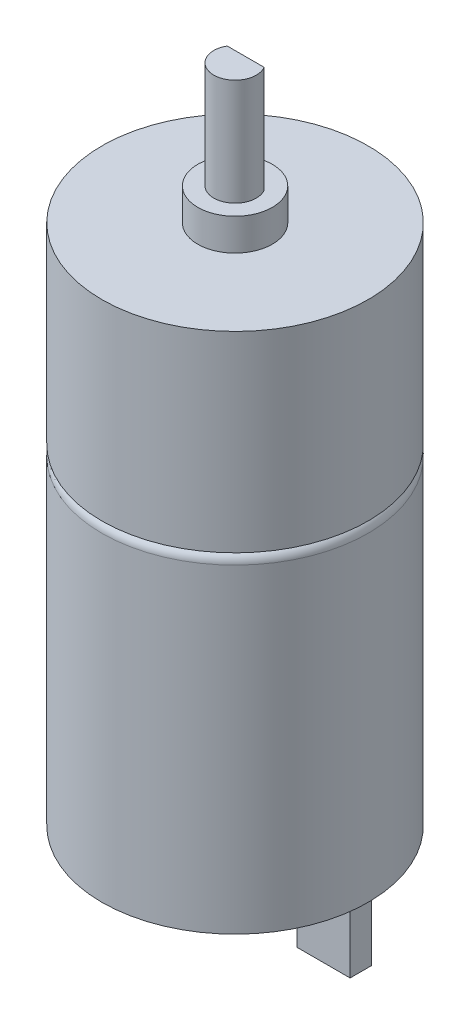
ISO-10303-21;
HEADER;
FILE_DESCRIPTION(('STEP AP214'),'2;1');
FILE_NAME('part.step','',(''),(''),'','','');
FILE_SCHEMA(('AUTOMOTIVE_DESIGN { 1 0 10303 214 1 1 1 1 }'));
ENDSEC;
DATA;
#1=APPLICATION_CONTEXT('core data for automotive mechanical design processes');
#2=APPLICATION_PROTOCOL_DEFINITION('international standard','automotive_design',2000,#1);
#3=PRODUCT_CONTEXT('',#1,'mechanical');
#4=PRODUCT('Part','Part','',(#3));
#5=PRODUCT_RELATED_PRODUCT_CATEGORY('part','',(#4));
#6=PRODUCT_DEFINITION_FORMATION('','',#4);
#7=PRODUCT_DEFINITION_CONTEXT('part definition',#1,'design');
#8=PRODUCT_DEFINITION('design','',#6,#7);
#9=PRODUCT_DEFINITION_SHAPE('','',#8);
#10=(LENGTH_UNIT() NAMED_UNIT(*) SI_UNIT(.MILLI.,.METRE.));
#11=(NAMED_UNIT(*) PLANE_ANGLE_UNIT() SI_UNIT($,.RADIAN.));
#12=(NAMED_UNIT(*) SI_UNIT($,.STERADIAN.) SOLID_ANGLE_UNIT());
#13=UNCERTAINTY_MEASURE_WITH_UNIT(LENGTH_MEASURE(1.E-05),#10,'distance_accuracy_value','');
#14=(GEOMETRIC_REPRESENTATION_CONTEXT(3) GLOBAL_UNCERTAINTY_ASSIGNED_CONTEXT((#13)) GLOBAL_UNIT_ASSIGNED_CONTEXT((#10,
#11,#12)) REPRESENTATION_CONTEXT('',''));
#15=CARTESIAN_POINT('',(0.,0.,0.));
#16=DIRECTION('',(0.,0.,1.));
#17=DIRECTION('',(1.,0.,0.));
#18=AXIS2_PLACEMENT_3D('',#15,#16,#17);
#19=CARTESIAN_POINT('',(0.,0.,0.));
#20=DIRECTION('',(0.,1.,0.));
#21=DIRECTION('',(0.,0.,1.));
#22=AXIS2_PLACEMENT_3D('',#19,#20,#21);
#23=PLANE('',#22);
#24=DIRECTION('',(0.,0.,1.));
#25=VECTOR('',#24,1.);
#26=CARTESIAN_POINT('',(-6.8,0.,-1.));
#27=LINE('',#26,#25);
#28=CARTESIAN_POINT('',(-6.8,0.,-1.));
#29=VERTEX_POINT('',#28);
#30=CARTESIAN_POINT('',(-6.8,0.,0.999999999999999));
#31=VERTEX_POINT('',#30);
#32=EDGE_CURVE('E168',#29,#31,#27,.T.);
#33=ORIENTED_EDGE('',*,*,#32,.F.);
#34=DIRECTION('',(1.,0.,0.));
#35=VECTOR('',#34,1.);
#36=CARTESIAN_POINT('',(-11.8,0.,-1.));
#37=LINE('',#36,#35);
#38=CARTESIAN_POINT('',(-11.8,0.,-1.));
#39=VERTEX_POINT('',#38);
#40=EDGE_CURVE('E173',#39,#29,#37,.T.);
#41=ORIENTED_EDGE('',*,*,#40,.F.);
#42=DIRECTION('',(0.,0.,-1.));
#43=VECTOR('',#42,1.);
#44=CARTESIAN_POINT('',(-11.8,0.,-1.));
#45=LINE('',#44,#43);
#46=CARTESIAN_POINT('',(-11.8,0.,0.999999999999999));
#47=VERTEX_POINT('',#46);
#48=EDGE_CURVE('E185',#47,#39,#45,.T.);
#49=ORIENTED_EDGE('',*,*,#48,.F.);
#50=DIRECTION('',(-1.,0.,0.));
#51=VECTOR('',#50,1.);
#52=CARTESIAN_POINT('',(-11.8,0.,0.999999999999999));
#53=LINE('',#52,#51);
#54=EDGE_CURVE('E182',#31,#47,#53,.T.);
#55=ORIENTED_EDGE('',*,*,#54,.F.);
#56=EDGE_LOOP('',(#33,#41,#49,#55));
#57=FACE_BOUND('',#56,.T.);
#58=CARTESIAN_POINT('',(0.,0.,0.));
#59=DIRECTION('',(0.,1.,0.));
#60=DIRECTION('',(0.,0.,1.));
#61=AXIS2_PLACEMENT_3D('',#58,#59,#60);
#62=CIRCLE('',#61,12.5);
#63=CARTESIAN_POINT('',(0.,0.,12.5));
#64=VERTEX_POINT('',#63);
#65=EDGE_CURVE('E205',#64,#64,#62,.T.);
#66=ORIENTED_EDGE('',*,*,#65,.F.);
#67=EDGE_LOOP('',(#66));
#68=FACE_BOUND('',#67,.T.);
#69=DIRECTION('',(0.,0.,1.));
#70=VECTOR('',#69,1.);
#71=CARTESIAN_POINT('',(11.8,0.,-1.));
#72=LINE('',#71,#70);
#73=CARTESIAN_POINT('',(11.8,0.,-1.));
#74=VERTEX_POINT('',#73);
#75=CARTESIAN_POINT('',(11.8,0.,0.999999999999999));
#76=VERTEX_POINT('',#75);
#77=EDGE_CURVE('E134',#74,#76,#72,.T.);
#78=ORIENTED_EDGE('',*,*,#77,.F.);
#79=DIRECTION('',(1.,0.,0.));
#80=VECTOR('',#79,1.);
#81=CARTESIAN_POINT('',(11.8,0.,-1.));
#82=LINE('',#81,#80);
#83=CARTESIAN_POINT('',(6.8,0.,-1.));
#84=VERTEX_POINT('',#83);
#85=EDGE_CURVE('E143',#84,#74,#82,.T.);
#86=ORIENTED_EDGE('',*,*,#85,.F.);
#87=DIRECTION('',(0.,0.,-1.));
#88=VECTOR('',#87,1.);
#89=CARTESIAN_POINT('',(6.8,0.,-1.));
#90=LINE('',#89,#88);
#91=CARTESIAN_POINT('',(6.8,0.,0.999999999999999));
#92=VERTEX_POINT('',#91);
#93=EDGE_CURVE('E153',#92,#84,#90,.T.);
#94=ORIENTED_EDGE('',*,*,#93,.F.);
#95=DIRECTION('',(-1.,0.,0.));
#96=VECTOR('',#95,1.);
#97=CARTESIAN_POINT('',(11.8,0.,0.999999999999999));
#98=LINE('',#97,#96);
#99=EDGE_CURVE('E60',#76,#92,#98,.T.);
#100=ORIENTED_EDGE('',*,*,#99,.F.);
#101=EDGE_LOOP('',(#78,#86,#94,#100));
#102=FACE_BOUND('',#101,.T.);
#103=ADVANCED_FACE('F37',(#57,#68,#102),#23,.F.);
#104=CARTESIAN_POINT('',(0.,31.,0.));
#105=DIRECTION('',(0.,-1.,0.));
#106=DIRECTION('',(0.,0.,-1.));
#107=AXIS2_PLACEMENT_3D('',#104,#105,#106);
#108=CYLINDRICAL_SURFACE('',#107,12.5);
#109=CARTESIAN_POINT('',(0.,30.,0.));
#110=DIRECTION('',(0.,1.,0.));
#111=DIRECTION('',(0.,0.,1.));
#112=AXIS2_PLACEMENT_3D('',#109,#110,#111);
#113=CIRCLE('',#112,12.5);
#114=CARTESIAN_POINT('',(0.,30.,12.5));
#115=VERTEX_POINT('',#114);
#116=EDGE_CURVE('E41',#115,#115,#113,.F.);
#117=ORIENTED_EDGE('',*,*,#116,.T.);
#118=EDGE_LOOP('',(#117));
#119=FACE_BOUND('',#118,.T.);
#120=ORIENTED_EDGE('',*,*,#65,.T.);
#121=EDGE_LOOP('',(#120));
#122=FACE_BOUND('',#121,.T.);
#123=ADVANCED_FACE('F216',(#119,#122),#108,.T.);
#124=CARTESIAN_POINT('',(0.,30.,0.));
#125=DIRECTION('',(0.,1.,0.));
#126=DIRECTION('',(0.,0.,1.));
#127=AXIS2_PLACEMENT_3D('',#124,#125,#126);
#128=TOROIDAL_SURFACE('',#127,11.5,1.);
#129=ORIENTED_EDGE('',*,*,#116,.F.);
#130=EDGE_LOOP('',(#129));
#131=FACE_BOUND('',#130,.T.);
#132=CARTESIAN_POINT('',(0.,31.,0.));
#133=DIRECTION('',(0.,1.,0.));
#134=DIRECTION('',(0.,0.,1.));
#135=AXIS2_PLACEMENT_3D('',#132,#133,#134);
#136=CIRCLE('',#135,11.5);
#137=CARTESIAN_POINT('',(0.,31.,11.5));
#138=VERTEX_POINT('',#137);
#139=EDGE_CURVE('E209',#138,#138,#136,.T.);
#140=ORIENTED_EDGE('',*,*,#139,.F.);
#141=EDGE_LOOP('',(#140));
#142=FACE_BOUND('',#141,.T.);
#143=ADVANCED_FACE('F39',(#131,#142),#128,.T.);
#144=CARTESIAN_POINT('',(0.,49.,0.));
#145=DIRECTION('',(0.,-1.,0.));
#146=DIRECTION('',(0.,0.,-1.));
#147=AXIS2_PLACEMENT_3D('',#144,#145,#146);
#148=CYLINDRICAL_SURFACE('',#147,12.5);
#149=CARTESIAN_POINT('',(0.,49.,0.));
#150=DIRECTION('',(0.,1.,0.));
#151=DIRECTION('',(0.,0.,1.));
#152=AXIS2_PLACEMENT_3D('',#149,#150,#151);
#153=CIRCLE('',#152,12.5);
#154=CARTESIAN_POINT('',(0.,49.,12.5));
#155=VERTEX_POINT('',#154);
#156=EDGE_CURVE('E202',#155,#155,#153,.T.);
#157=ORIENTED_EDGE('',*,*,#156,.F.);
#158=EDGE_LOOP('',(#157));
#159=FACE_BOUND('',#158,.T.);
#160=CARTESIAN_POINT('',(0.,31.,0.));
#161=DIRECTION('',(0.,1.,0.));
#162=DIRECTION('',(0.,0.,1.));
#163=AXIS2_PLACEMENT_3D('',#160,#161,#162);
#164=CIRCLE('',#163,12.5);
#165=CARTESIAN_POINT('',(0.,31.,12.5));
#166=VERTEX_POINT('',#165);
#167=EDGE_CURVE('E201',#166,#166,#164,.T.);
#168=ORIENTED_EDGE('',*,*,#167,.T.);
#169=EDGE_LOOP('',(#168));
#170=FACE_BOUND('',#169,.T.);
#171=ADVANCED_FACE('F221',(#159,#170),#148,.T.);
#172=CARTESIAN_POINT('',(0.,49.,0.));
#173=DIRECTION('',(0.,1.,0.));
#174=DIRECTION('',(0.,0.,1.));
#175=AXIS2_PLACEMENT_3D('',#172,#173,#174);
#176=PLANE('',#175);
#177=CARTESIAN_POINT('',(0.,49.,0.));
#178=DIRECTION('',(0.,1.,0.));
#179=DIRECTION('',(0.,0.,1.));
#180=AXIS2_PLACEMENT_3D('',#177,#178,#179);
#181=CIRCLE('',#180,3.5);
#182=CARTESIAN_POINT('',(0.,49.,3.5));
#183=VERTEX_POINT('',#182);
#184=EDGE_CURVE('E11',#183,#183,#181,.T.);
#185=ORIENTED_EDGE('',*,*,#184,.F.);
#186=EDGE_LOOP('',(#185));
#187=FACE_BOUND('',#186,.T.);
#188=ORIENTED_EDGE('',*,*,#156,.T.);
#189=EDGE_LOOP('',(#188));
#190=FACE_BOUND('',#189,.T.);
#191=ADVANCED_FACE('F226',(#187,#190),#176,.T.);
#192=CARTESIAN_POINT('',(0.,31.,0.));
#193=DIRECTION('',(0.,1.,0.));
#194=DIRECTION('',(0.,0.,1.));
#195=AXIS2_PLACEMENT_3D('',#192,#193,#194);
#196=PLANE('',#195);
#197=ORIENTED_EDGE('',*,*,#139,.T.);
#198=EDGE_LOOP('',(#197));
#199=FACE_BOUND('',#198,.T.);
#200=ORIENTED_EDGE('',*,*,#167,.F.);
#201=EDGE_LOOP('',(#200));
#202=FACE_BOUND('',#201,.T.);
#203=ADVANCED_FACE('F236',(#199,#202),#196,.F.);
#204=CARTESIAN_POINT('',(-6.8,-6.,-1.));
#205=DIRECTION('',(-1.,0.,0.));
#206=DIRECTION('',(0.,0.,1.));
#207=AXIS2_PLACEMENT_3D('',#204,#205,#206);
#208=PLANE('',#207);
#209=ORIENTED_EDGE('',*,*,#32,.T.);
#210=DIRECTION('',(0.,1.,0.));
#211=VECTOR('',#210,1.);
#212=CARTESIAN_POINT('',(-6.8,-6.,0.999999999999999));
#213=LINE('',#212,#211);
#214=CARTESIAN_POINT('',(-6.8,-6.,0.999999999999999));
#215=VERTEX_POINT('',#214);
#216=EDGE_CURVE('E198',#215,#31,#213,.T.);
#217=ORIENTED_EDGE('',*,*,#216,.F.);
#218=DIRECTION('',(0.,0.,1.));
#219=VECTOR('',#218,1.);
#220=CARTESIAN_POINT('',(-6.8,-6.,-1.));
#221=LINE('',#220,#219);
#222=CARTESIAN_POINT('',(-6.8,-6.,-1.));
#223=VERTEX_POINT('',#222);
#224=EDGE_CURVE('E169',#223,#215,#221,.T.);
#225=ORIENTED_EDGE('',*,*,#224,.F.);
#226=DIRECTION('',(0.,1.,0.));
#227=VECTOR('',#226,1.);
#228=CARTESIAN_POINT('',(-6.8,-6.,-1.));
#229=LINE('',#228,#227);
#230=EDGE_CURVE('E179',#223,#29,#229,.T.);
#231=ORIENTED_EDGE('',*,*,#230,.T.);
#232=EDGE_LOOP('',(#209,#217,#225,#231));
#233=FACE_BOUND('',#232,.T.);
#234=ADVANCED_FACE('F239',(#233),#208,.F.);
#235=CARTESIAN_POINT('',(-11.8,-6.,0.999999999999999));
#236=DIRECTION('',(0.,0.,-1.));
#237=DIRECTION('',(-1.,0.,0.));
#238=AXIS2_PLACEMENT_3D('',#235,#236,#237);
#239=PLANE('',#238);
#240=ORIENTED_EDGE('',*,*,#54,.T.);
#241=DIRECTION('',(0.,1.,0.));
#242=VECTOR('',#241,1.);
#243=CARTESIAN_POINT('',(-11.8,-6.,0.999999999999999));
#244=LINE('',#243,#242);
#245=CARTESIAN_POINT('',(-11.8,-6.,0.999999999999999));
#246=VERTEX_POINT('',#245);
#247=EDGE_CURVE('E195',#246,#47,#244,.T.);
#248=ORIENTED_EDGE('',*,*,#247,.F.);
#249=DIRECTION('',(-1.,0.,0.));
#250=VECTOR('',#249,1.);
#251=CARTESIAN_POINT('',(-11.8,-6.,0.999999999999999));
#252=LINE('',#251,#250);
#253=EDGE_CURVE('E172',#215,#246,#252,.T.);
#254=ORIENTED_EDGE('',*,*,#253,.F.);
#255=ORIENTED_EDGE('',*,*,#216,.T.);
#256=EDGE_LOOP('',(#240,#248,#254,#255));
#257=FACE_BOUND('',#256,.T.);
#258=ADVANCED_FACE('F245',(#257),#239,.F.);
#259=CARTESIAN_POINT('',(-11.8,-6.,-1.));
#260=DIRECTION('',(1.,0.,0.));
#261=DIRECTION('',(0.,0.,-1.));
#262=AXIS2_PLACEMENT_3D('',#259,#260,#261);
#263=PLANE('',#262);
#264=ORIENTED_EDGE('',*,*,#48,.T.);
#265=DIRECTION('',(0.,1.,0.));
#266=VECTOR('',#265,1.);
#267=CARTESIAN_POINT('',(-11.8,-6.,-1.));
#268=LINE('',#267,#266);
#269=CARTESIAN_POINT('',(-11.8,-6.,-1.));
#270=VERTEX_POINT('',#269);
#271=EDGE_CURVE('E192',#270,#39,#268,.T.);
#272=ORIENTED_EDGE('',*,*,#271,.F.);
#273=DIRECTION('',(0.,0.,-1.));
#274=VECTOR('',#273,1.);
#275=CARTESIAN_POINT('',(-11.8,-6.,-1.));
#276=LINE('',#275,#274);
#277=EDGE_CURVE('E175',#246,#270,#276,.T.);
#278=ORIENTED_EDGE('',*,*,#277,.F.);
#279=ORIENTED_EDGE('',*,*,#247,.T.);
#280=EDGE_LOOP('',(#264,#272,#278,#279));
#281=FACE_BOUND('',#280,.T.);
#282=ADVANCED_FACE('F249',(#281),#263,.F.);
#283=CARTESIAN_POINT('',(-11.8,-6.,-1.));
#284=DIRECTION('',(0.,0.,1.));
#285=DIRECTION('',(1.,0.,0.));
#286=AXIS2_PLACEMENT_3D('',#283,#284,#285);
#287=PLANE('',#286);
#288=ORIENTED_EDGE('',*,*,#40,.T.);
#289=ORIENTED_EDGE('',*,*,#230,.F.);
#290=DIRECTION('',(1.,0.,0.));
#291=VECTOR('',#290,1.);
#292=CARTESIAN_POINT('',(-11.8,-6.,-1.));
#293=LINE('',#292,#291);
#294=EDGE_CURVE('E177',#270,#223,#293,.T.);
#295=ORIENTED_EDGE('',*,*,#294,.F.);
#296=ORIENTED_EDGE('',*,*,#271,.T.);
#297=EDGE_LOOP('',(#288,#289,#295,#296));
#298=FACE_BOUND('',#297,.T.);
#299=ADVANCED_FACE('F253',(#298),#287,.F.);
#300=CARTESIAN_POINT('',(0.,-6.,0.));
#301=DIRECTION('',(0.,1.,0.));
#302=DIRECTION('',(0.,0.,1.));
#303=AXIS2_PLACEMENT_3D('',#300,#301,#302);
#304=PLANE('',#303);
#305=ORIENTED_EDGE('',*,*,#224,.T.);
#306=ORIENTED_EDGE('',*,*,#253,.T.);
#307=ORIENTED_EDGE('',*,*,#277,.T.);
#308=ORIENTED_EDGE('',*,*,#294,.T.);
#309=EDGE_LOOP('',(#305,#306,#307,#308));
#310=FACE_BOUND('',#309,.T.);
#311=ADVANCED_FACE('F257',(#310),#304,.F.);
#312=CARTESIAN_POINT('',(11.8,-6.,-1.));
#313=DIRECTION('',(-1.,0.,0.));
#314=DIRECTION('',(0.,0.,1.));
#315=AXIS2_PLACEMENT_3D('',#312,#313,#314);
#316=PLANE('',#315);
#317=ORIENTED_EDGE('',*,*,#77,.T.);
#318=DIRECTION('',(0.,1.,0.));
#319=VECTOR('',#318,1.);
#320=CARTESIAN_POINT('',(11.8,-6.,0.999999999999999));
#321=LINE('',#320,#319);
#322=CARTESIAN_POINT('',(11.8,-6.,0.999999999999999));
#323=VERTEX_POINT('',#322);
#324=EDGE_CURVE('E166',#323,#76,#321,.T.);
#325=ORIENTED_EDGE('',*,*,#324,.F.);
#326=DIRECTION('',(0.,0.,1.));
#327=VECTOR('',#326,1.);
#328=CARTESIAN_POINT('',(11.8,-6.,-1.));
#329=LINE('',#328,#327);
#330=CARTESIAN_POINT('',(11.8,-6.,-1.));
#331=VERTEX_POINT('',#330);
#332=EDGE_CURVE('E139',#331,#323,#329,.T.);
#333=ORIENTED_EDGE('',*,*,#332,.F.);
#334=DIRECTION('',(0.,1.,0.));
#335=VECTOR('',#334,1.);
#336=CARTESIAN_POINT('',(11.8,-6.,-1.));
#337=LINE('',#336,#335);
#338=EDGE_CURVE('E149',#331,#74,#337,.T.);
#339=ORIENTED_EDGE('',*,*,#338,.T.);
#340=EDGE_LOOP('',(#317,#325,#333,#339));
#341=FACE_BOUND('',#340,.T.);
#342=ADVANCED_FACE('F261',(#341),#316,.F.);
#343=CARTESIAN_POINT('',(11.8,-6.,0.999999999999999));
#344=DIRECTION('',(0.,0.,-1.));
#345=DIRECTION('',(-1.,0.,0.));
#346=AXIS2_PLACEMENT_3D('',#343,#344,#345);
#347=PLANE('',#346);
#348=ORIENTED_EDGE('',*,*,#99,.T.);
#349=DIRECTION('',(0.,1.,0.));
#350=VECTOR('',#349,1.);
#351=CARTESIAN_POINT('',(6.8,-6.,0.999999999999999));
#352=LINE('',#351,#350);
#353=CARTESIAN_POINT('',(6.8,-6.,0.999999999999999));
#354=VERTEX_POINT('',#353);
#355=EDGE_CURVE('E163',#354,#92,#352,.T.);
#356=ORIENTED_EDGE('',*,*,#355,.F.);
#357=DIRECTION('',(-1.,0.,0.));
#358=VECTOR('',#357,1.);
#359=CARTESIAN_POINT('',(11.8,-6.,0.999999999999999));
#360=LINE('',#359,#358);
#361=EDGE_CURVE('E142',#323,#354,#360,.T.);
#362=ORIENTED_EDGE('',*,*,#361,.F.);
#363=ORIENTED_EDGE('',*,*,#324,.T.);
#364=EDGE_LOOP('',(#348,#356,#362,#363));
#365=FACE_BOUND('',#364,.T.);
#366=ADVANCED_FACE('F265',(#365),#347,.F.);
#367=CARTESIAN_POINT('',(6.8,-6.,-1.));
#368=DIRECTION('',(1.,0.,0.));
#369=DIRECTION('',(0.,0.,-1.));
#370=AXIS2_PLACEMENT_3D('',#367,#368,#369);
#371=PLANE('',#370);
#372=ORIENTED_EDGE('',*,*,#93,.T.);
#373=DIRECTION('',(0.,1.,0.));
#374=VECTOR('',#373,1.);
#375=CARTESIAN_POINT('',(6.8,-6.,-1.));
#376=LINE('',#375,#374);
#377=CARTESIAN_POINT('',(6.8,-6.,-1.));
#378=VERTEX_POINT('',#377);
#379=EDGE_CURVE('E160',#378,#84,#376,.T.);
#380=ORIENTED_EDGE('',*,*,#379,.F.);
#381=DIRECTION('',(0.,0.,-1.));
#382=VECTOR('',#381,1.);
#383=CARTESIAN_POINT('',(6.8,-6.,-1.));
#384=LINE('',#383,#382);
#385=EDGE_CURVE('E145',#354,#378,#384,.T.);
#386=ORIENTED_EDGE('',*,*,#385,.F.);
#387=ORIENTED_EDGE('',*,*,#355,.T.);
#388=EDGE_LOOP('',(#372,#380,#386,#387));
#389=FACE_BOUND('',#388,.T.);
#390=ADVANCED_FACE('F269',(#389),#371,.F.);
#391=CARTESIAN_POINT('',(11.8,-6.,-1.));
#392=DIRECTION('',(0.,0.,1.));
#393=DIRECTION('',(1.,0.,0.));
#394=AXIS2_PLACEMENT_3D('',#391,#392,#393);
#395=PLANE('',#394);
#396=ORIENTED_EDGE('',*,*,#85,.T.);
#397=ORIENTED_EDGE('',*,*,#338,.F.);
#398=DIRECTION('',(1.,0.,0.));
#399=VECTOR('',#398,1.);
#400=CARTESIAN_POINT('',(11.8,-6.,-1.));
#401=LINE('',#400,#399);
#402=EDGE_CURVE('E147',#378,#331,#401,.T.);
#403=ORIENTED_EDGE('',*,*,#402,.F.);
#404=ORIENTED_EDGE('',*,*,#379,.T.);
#405=EDGE_LOOP('',(#396,#397,#403,#404));
#406=FACE_BOUND('',#405,.T.);
#407=ADVANCED_FACE('F273',(#406),#395,.F.);
#408=CARTESIAN_POINT('',(0.,-6.,0.));
#409=DIRECTION('',(0.,-1.,0.));
#410=DIRECTION('',(0.,0.,-1.));
#411=AXIS2_PLACEMENT_3D('',#408,#409,#410);
#412=PLANE('',#411);
#413=ORIENTED_EDGE('',*,*,#332,.T.);
#414=ORIENTED_EDGE('',*,*,#361,.T.);
#415=ORIENTED_EDGE('',*,*,#385,.T.);
#416=ORIENTED_EDGE('',*,*,#402,.T.);
#417=EDGE_LOOP('',(#413,#414,#415,#416));
#418=FACE_BOUND('',#417,.T.);
#419=ADVANCED_FACE('F277',(#418),#412,.T.);
#420=CARTESIAN_POINT('',(0.,52.,0.));
#421=DIRECTION('',(0.,-1.,0.));
#422=DIRECTION('',(0.,0.,-1.));
#423=AXIS2_PLACEMENT_3D('',#420,#421,#422);
#424=CYLINDRICAL_SURFACE('',#423,3.5);
#425=CARTESIAN_POINT('',(0.,52.,0.));
#426=DIRECTION('',(0.,1.,0.));
#427=DIRECTION('',(0.,0.,1.));
#428=AXIS2_PLACEMENT_3D('',#425,#426,#427);
#429=CIRCLE('',#428,3.5);
#430=CARTESIAN_POINT('',(0.,52.,3.5));
#431=VERTEX_POINT('',#430);
#432=EDGE_CURVE('E131',#431,#431,#429,.T.);
#433=ORIENTED_EDGE('',*,*,#432,.F.);
#434=EDGE_LOOP('',(#433));
#435=FACE_BOUND('',#434,.T.);
#436=ORIENTED_EDGE('',*,*,#184,.T.);
#437=EDGE_LOOP('',(#436));
#438=FACE_BOUND('',#437,.T.);
#439=ADVANCED_FACE('F281',(#435,#438),#424,.T.);
#440=CARTESIAN_POINT('',(0.,52.,0.));
#441=DIRECTION('',(0.,1.,0.));
#442=DIRECTION('',(0.,0.,1.));
#443=AXIS2_PLACEMENT_3D('',#440,#441,#442);
#444=PLANE('',#443);
#445=DIRECTION('',(-1.,0.,0.));
#446=VECTOR('',#445,1.);
#447=CARTESIAN_POINT('',(0.,52.,-0.999999999999999));
#448=LINE('',#447,#446);
#449=CARTESIAN_POINT('',(1.73205080756888,52.,-0.999999999999999));
#450=VERTEX_POINT('',#449);
#451=CARTESIAN_POINT('',(-1.73205080756888,52.,-0.999999999999999));
#452=VERTEX_POINT('',#451);
#453=EDGE_CURVE('E130',#450,#452,#448,.T.);
#454=ORIENTED_EDGE('',*,*,#453,.F.);
#455=CARTESIAN_POINT('',(0.,52.,0.));
#456=DIRECTION('',(0.,1.,0.));
#457=DIRECTION('',(0.,0.,1.));
#458=AXIS2_PLACEMENT_3D('',#455,#456,#457);
#459=CIRCLE('',#458,2.);
#460=EDGE_CURVE('E52',#452,#450,#459,.T.);
#461=ORIENTED_EDGE('',*,*,#460,.F.);
#462=EDGE_LOOP('',(#454,#461));
#463=FACE_BOUND('',#462,.T.);
#464=ORIENTED_EDGE('',*,*,#432,.T.);
#465=EDGE_LOOP('',(#464));
#466=FACE_BOUND('',#465,.T.);
#467=ADVANCED_FACE('F285',(#463,#466),#444,.T.);
#468=CARTESIAN_POINT('',(0.,62.,-0.999999999999999));
#469=DIRECTION('',(0.,0.,1.));
#470=DIRECTION('',(1.,0.,0.));
#471=AXIS2_PLACEMENT_3D('',#468,#469,#470);
#472=PLANE('',#471);
#473=ORIENTED_EDGE('',*,*,#453,.T.);
#474=DIRECTION('',(0.,-1.,0.));
#475=VECTOR('',#474,1.);
#476=CARTESIAN_POINT('',(-1.73205080756888,62.,-0.999999999999999));
#477=LINE('',#476,#475);
#478=CARTESIAN_POINT('',(-1.73205080756888,62.,-0.999999999999999));
#479=VERTEX_POINT('',#478);
#480=EDGE_CURVE('E118',#479,#452,#477,.T.);
#481=ORIENTED_EDGE('',*,*,#480,.F.);
#482=DIRECTION('',(-1.,0.,0.));
#483=VECTOR('',#482,1.);
#484=CARTESIAN_POINT('',(0.,62.,-0.999999999999999));
#485=LINE('',#484,#483);
#486=CARTESIAN_POINT('',(1.73205080756888,62.,-0.999999999999999));
#487=VERTEX_POINT('',#486);
#488=EDGE_CURVE('E124',#487,#479,#485,.T.);
#489=ORIENTED_EDGE('',*,*,#488,.F.);
#490=DIRECTION('',(0.,-1.,0.));
#491=VECTOR('',#490,1.);
#492=CARTESIAN_POINT('',(1.73205080756888,62.,-0.999999999999999));
#493=LINE('',#492,#491);
#494=EDGE_CURVE('E121',#487,#450,#493,.T.);
#495=ORIENTED_EDGE('',*,*,#494,.T.);
#496=EDGE_LOOP('',(#473,#481,#489,#495));
#497=FACE_BOUND('',#496,.T.);
#498=ADVANCED_FACE('F129',(#497),#472,.F.);
#499=CARTESIAN_POINT('',(0.,62.,0.));
#500=DIRECTION('',(0.,-1.,0.));
#501=DIRECTION('',(0.,0.,-1.));
#502=AXIS2_PLACEMENT_3D('',#499,#500,#501);
#503=CYLINDRICAL_SURFACE('',#502,2.);
#504=ORIENTED_EDGE('',*,*,#460,.T.);
#505=ORIENTED_EDGE('',*,*,#494,.F.);
#506=CARTESIAN_POINT('',(0.,62.,0.));
#507=DIRECTION('',(0.,1.,0.));
#508=DIRECTION('',(0.,0.,1.));
#509=AXIS2_PLACEMENT_3D('',#506,#507,#508);
#510=CIRCLE('',#509,2.);
#511=EDGE_CURVE('E114',#479,#487,#510,.T.);
#512=ORIENTED_EDGE('',*,*,#511,.F.);
#513=ORIENTED_EDGE('',*,*,#480,.T.);
#514=EDGE_LOOP('',(#504,#505,#512,#513));
#515=FACE_BOUND('',#514,.T.);
#516=ADVANCED_FACE('F116',(#515),#503,.T.);
#517=CARTESIAN_POINT('',(0.,62.,0.));
#518=DIRECTION('',(0.,1.,0.));
#519=DIRECTION('',(0.,0.,1.));
#520=AXIS2_PLACEMENT_3D('',#517,#518,#519);
#521=PLANE('',#520);
#522=ORIENTED_EDGE('',*,*,#488,.T.);
#523=ORIENTED_EDGE('',*,*,#511,.T.);
#524=EDGE_LOOP('',(#522,#523));
#525=FACE_BOUND('',#524,.T.);
#526=ADVANCED_FACE('F126',(#525),#521,.T.);
#527=CLOSED_SHELL('',(#103,#123,#143,#171,#191,#203,#234,#258,#282,#299,#311,#342,#366,#390,
#407,#419,#439,#467,#498,#516,#526));
#528=MANIFOLD_SOLID_BREP('B2',#527);
#529=ADVANCED_BREP_SHAPE_REPRESENTATION('',(#18,#528),#14);
#530=SHAPE_DEFINITION_REPRESENTATION(#9,#529);
ENDSEC;
END-ISO-10303-21;
